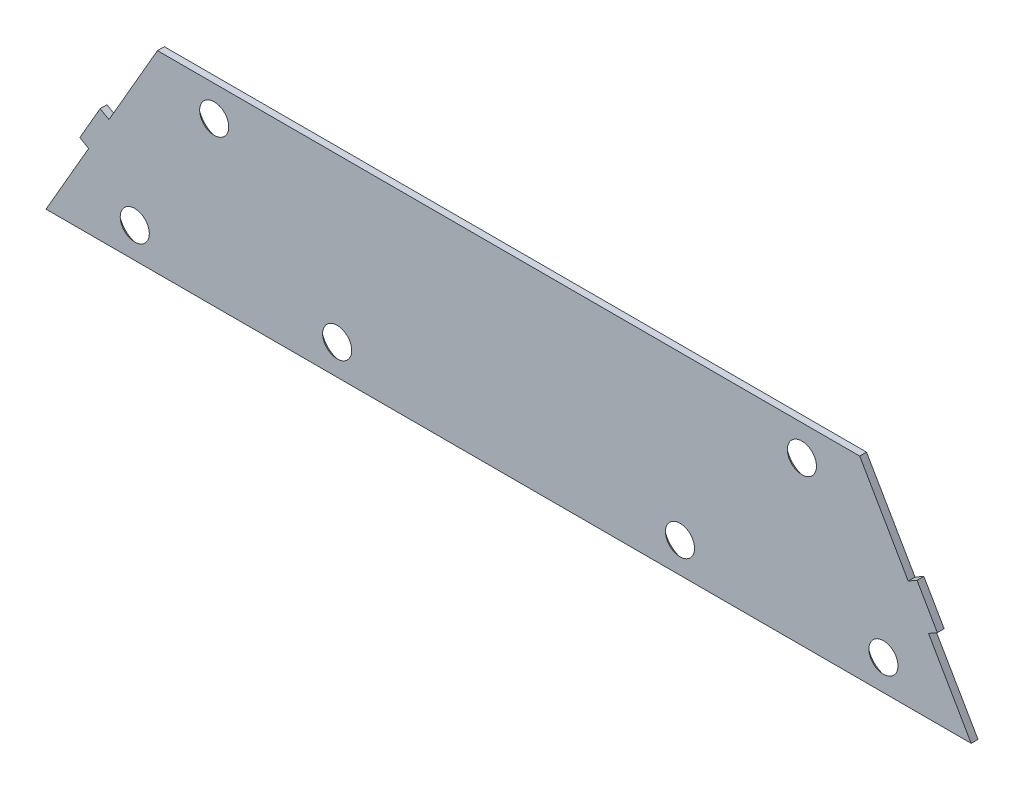
ISO-10303-21;
HEADER;
FILE_DESCRIPTION(('STEP AP214'),'2;1');
FILE_NAME('part.step','',(''),(''),'','','');
FILE_SCHEMA(('AUTOMOTIVE_DESIGN { 1 0 10303 214 1 1 1 1 }'));
ENDSEC;
DATA;
#1=APPLICATION_CONTEXT('core data for automotive mechanical design processes');
#2=APPLICATION_PROTOCOL_DEFINITION('international standard','automotive_design',2000,#1);
#3=PRODUCT_CONTEXT('',#1,'mechanical');
#4=PRODUCT('Part','Part','',(#3));
#5=PRODUCT_RELATED_PRODUCT_CATEGORY('part','',(#4));
#6=PRODUCT_DEFINITION_FORMATION('','',#4);
#7=PRODUCT_DEFINITION_CONTEXT('part definition',#1,'design');
#8=PRODUCT_DEFINITION('design','',#6,#7);
#9=PRODUCT_DEFINITION_SHAPE('','',#8);
#10=(LENGTH_UNIT() NAMED_UNIT(*) SI_UNIT(.MILLI.,.METRE.));
#11=(NAMED_UNIT(*) PLANE_ANGLE_UNIT() SI_UNIT($,.RADIAN.));
#12=(NAMED_UNIT(*) SI_UNIT($,.STERADIAN.) SOLID_ANGLE_UNIT());
#13=UNCERTAINTY_MEASURE_WITH_UNIT(LENGTH_MEASURE(1.E-05),#10,'distance_accuracy_value','');
#14=(GEOMETRIC_REPRESENTATION_CONTEXT(3) GLOBAL_UNCERTAINTY_ASSIGNED_CONTEXT((#13)) GLOBAL_UNIT_ASSIGNED_CONTEXT((#10,
#11,#12)) REPRESENTATION_CONTEXT('',''));
#15=CARTESIAN_POINT('',(0.,0.,0.));
#16=DIRECTION('',(0.,0.,1.));
#17=DIRECTION('',(1.,0.,0.));
#18=AXIS2_PLACEMENT_3D('',#15,#16,#17);
#19=CARTESIAN_POINT('',(0.,0.,1.0668));
#20=DIRECTION('',(0.,0.,1.));
#21=DIRECTION('',(1.,0.,0.));
#22=AXIS2_PLACEMENT_3D('',#19,#20,#21);
#23=PLANE('',#22);
#24=DIRECTION('',(-0.500000000000004,-0.866025403784436,0.));
#25=VECTOR('',#24,1.);
#26=CARTESIAN_POINT('',(-45.2150460747579,27.8355816877417,1.0668));
#27=LINE('',#26,#25);
#28=CARTESIAN_POINT('',(-64.1112230909537,-4.89355697312434,1.0668));
#29=VERTEX_POINT('',#28);
#30=CARTESIAN_POINT('',(-70.7726150620005,-16.4314263161086,1.0668));
#31=VERTEX_POINT('',#30);
#32=EDGE_CURVE('E129',#29,#31,#27,.T.);
#33=ORIENTED_EDGE('',*,*,#32,.T.);
#34=DIRECTION('',(1.,0.,0.));
#35=VECTOR('',#34,1.);
#36=CARTESIAN_POINT('',(75.603297833322,-16.4314263161089,1.0668));
#37=LINE('',#36,#35);
#38=CARTESIAN_POINT('',(73.7702107286445,-16.4314263161089,1.0668));
#39=VERTEX_POINT('',#38);
#40=EDGE_CURVE('E46',#31,#39,#37,.T.);
#41=ORIENTED_EDGE('',*,*,#40,.T.);
#42=DIRECTION('',(0.499999999999999,-0.866025403784439,0.));
#43=VECTOR('',#42,1.);
#44=CARTESIAN_POINT('',(48.2126417414022,27.8355816877415,1.0668));
#45=LINE('',#44,#43);
#46=CARTESIAN_POINT('',(67.1088187575979,-4.89355697312468,1.0668));
#47=VERTEX_POINT('',#46);
#48=EDGE_CURVE('E233',#47,#39,#45,.T.);
#49=ORIENTED_EDGE('',*,*,#48,.F.);
#50=DIRECTION('',(-0.866025403784438,-0.5,0.));
#51=VECTOR('',#50,1.);
#52=CARTESIAN_POINT('',(18.8961770161957,-32.7291386608662,1.0668));
#53=LINE('',#52,#51);
#54=CARTESIAN_POINT('',(68.4836340861059,-4.09980697312453,1.0668));
#55=VERTEX_POINT('',#54);
#56=EDGE_CURVE('E227',#55,#47,#53,.T.);
#57=ORIENTED_EDGE('',*,*,#56,.F.);
#58=DIRECTION('',(-0.500000000000004,0.866025403784436,0.));
#59=VECTOR('',#58,1.);
#60=CARTESIAN_POINT('',(58.1889703388898,13.731073683891,1.0668));
#61=LINE('',#60,#59);
#62=CARTESIAN_POINT('',(65.3086340861059,1.39945434090666,1.0668));
#63=VERTEX_POINT('',#62);
#64=EDGE_CURVE('E11',#55,#63,#61,.T.);
#65=ORIENTED_EDGE('',*,*,#64,.T.);
#66=DIRECTION('',(-0.866025403784439,-0.5,0.));
#67=VECTOR('',#66,1.);
#68=CARTESIAN_POINT('',(15.7211770161957,-27.229877346835,1.0668));
#69=LINE('',#68,#67);
#70=CARTESIAN_POINT('',(63.9338187575978,0.60570434090652,1.0668));
#71=VERTEX_POINT('',#70);
#72=EDGE_CURVE('E217',#63,#71,#69,.T.);
#73=ORIENTED_EDGE('',*,*,#72,.T.);
#74=DIRECTION('',(-0.5,0.866025403784439,0.));
#75=VECTOR('',#74,1.);
#76=CARTESIAN_POINT('',(48.2126417414022,27.8355816877415,1.0668));
#77=LINE('',#76,#75);
#78=CARTESIAN_POINT('',(56.3558832342125,13.731073683891,1.0668));
#79=VERTEX_POINT('',#78);
#80=EDGE_CURVE('E211',#71,#79,#77,.T.);
#81=ORIENTED_EDGE('',*,*,#80,.T.);
#82=DIRECTION('',(-1.,0.,0.));
#83=VECTOR('',#82,1.);
#84=CARTESIAN_POINT('',(58.1889703388898,13.731073683891,1.0668));
#85=LINE('',#84,#83);
#86=CARTESIAN_POINT('',(-53.3582875675682,13.7310736838913,1.0668));
#87=VERTEX_POINT('',#86);
#88=EDGE_CURVE('E150',#79,#87,#85,.T.);
#89=ORIENTED_EDGE('',*,*,#88,.T.);
#90=DIRECTION('',(0.500000000000005,0.866025403784436,0.));
#91=VECTOR('',#90,1.);
#92=CARTESIAN_POINT('',(-45.2150460747579,27.8355816877418,1.0668));
#93=LINE('',#92,#91);
#94=CARTESIAN_POINT('',(-60.9362230909537,0.605704340906837,1.0668));
#95=VERTEX_POINT('',#94);
#96=EDGE_CURVE('E243',#95,#87,#93,.T.);
#97=ORIENTED_EDGE('',*,*,#96,.F.);
#98=DIRECTION('',(0.866025403784436,-0.500000000000004,0.));
#99=VECTOR('',#98,1.);
#100=CARTESIAN_POINT('',(-12.7235813495517,-27.2298773468349,1.0668));
#101=LINE('',#100,#99);
#102=CARTESIAN_POINT('',(-62.3110384194617,1.39945434090699,1.0668));
#103=VERTEX_POINT('',#102);
#104=EDGE_CURVE('E249',#103,#95,#101,.T.);
#105=ORIENTED_EDGE('',*,*,#104,.F.);
#106=DIRECTION('',(-0.500000000000008,-0.866025403784434,0.));
#107=VECTOR('',#106,1.);
#108=CARTESIAN_POINT('',(-55.1913746722455,13.731073683891,1.0668));
#109=LINE('',#108,#107);
#110=CARTESIAN_POINT('',(-65.4860384194617,-4.09980697312419,1.0668));
#111=VERTEX_POINT('',#110);
#112=EDGE_CURVE('E148',#103,#111,#109,.T.);
#113=ORIENTED_EDGE('',*,*,#112,.T.);
#114=DIRECTION('',(0.866025403784436,-0.500000000000005,0.));
#115=VECTOR('',#114,1.);
#116=CARTESIAN_POINT('',(-15.8985813495517,-32.7291386608661,1.0668));
#117=LINE('',#116,#115);
#118=EDGE_CURVE('E135',#111,#29,#117,.T.);
#119=ORIENTED_EDGE('',*,*,#118,.T.);
#120=EDGE_LOOP('',(#33,#41,#49,#57,#65,#73,#81,#89,#97,#105,#113,#119));
#121=FACE_BOUND('',#120,.T.);
#122=CARTESIAN_POINT('',(28.2788107286445,-11.6689263161091,1.0668));
#123=DIRECTION('',(0.,0.,1.));
#124=DIRECTION('',(1.,0.,0.));
#125=AXIS2_PLACEMENT_3D('',#122,#123,#124);
#126=CIRCLE('',#125,2.27193726742048);
#127=CARTESIAN_POINT('',(30.550747996065,-11.6689263161091,1.0668));
#128=VERTEX_POINT('',#127);
#129=EDGE_CURVE('E200',#128,#128,#126,.T.);
#130=ORIENTED_EDGE('',*,*,#129,.F.);
#131=EDGE_LOOP('',(#130));
#132=FACE_BOUND('',#131,.T.);
#133=CARTESIAN_POINT('',(60.0627849379986,-11.668926316109,1.0668));
#134=DIRECTION('',(0.,0.,1.));
#135=DIRECTION('',(1.,0.,0.));
#136=AXIS2_PLACEMENT_3D('',#133,#134,#135);
#137=CIRCLE('',#136,2.27193726742048);
#138=CARTESIAN_POINT('',(62.3347222054191,-11.668926316109,1.0668));
#139=VERTEX_POINT('',#138);
#140=EDGE_CURVE('E182',#139,#139,#137,.T.);
#141=ORIENTED_EDGE('',*,*,#140,.F.);
#142=EDGE_LOOP('',(#141));
#143=FACE_BOUND('',#142,.T.);
#144=CARTESIAN_POINT('',(-25.2812150620014,-11.668926316109,1.0668));
#145=DIRECTION('',(0.,0.,1.));
#146=DIRECTION('',(1.,0.,0.));
#147=AXIS2_PLACEMENT_3D('',#144,#145,#146);
#148=CIRCLE('',#147,2.27193726742048);
#149=CARTESIAN_POINT('',(-23.0092777945809,-11.668926316109,1.0668));
#150=VERTEX_POINT('',#149);
#151=EDGE_CURVE('E158',#150,#150,#148,.T.);
#152=ORIENTED_EDGE('',*,*,#151,.F.);
#153=EDGE_LOOP('',(#152));
#154=FACE_BOUND('',#153,.T.);
#155=CARTESIAN_POINT('',(-56.9042150620014,-11.668926316109,1.0668));
#156=DIRECTION('',(0.,0.,1.));
#157=DIRECTION('',(1.,0.,0.));
#158=AXIS2_PLACEMENT_3D('',#155,#156,#157);
#159=CIRCLE('',#158,2.27193726742048);
#160=CARTESIAN_POINT('',(-54.6322777945809,-11.668926316109,1.0668));
#161=VERTEX_POINT('',#160);
#162=EDGE_CURVE('E176',#161,#161,#159,.T.);
#163=ORIENTED_EDGE('',*,*,#162,.F.);
#164=EDGE_LOOP('',(#163));
#165=FACE_BOUND('',#164,.T.);
#166=CARTESIAN_POINT('',(47.3288107286445,8.96857368389085,1.0668));
#167=DIRECTION('',(0.,0.,1.));
#168=DIRECTION('',(1.,0.,0.));
#169=AXIS2_PLACEMENT_3D('',#166,#167,#168);
#170=CIRCLE('',#169,2.27193726742048);
#171=CARTESIAN_POINT('',(49.600747996065,8.96857368389085,1.0668));
#172=VERTEX_POINT('',#171);
#173=EDGE_CURVE('E188',#172,#172,#170,.T.);
#174=ORIENTED_EDGE('',*,*,#173,.F.);
#175=EDGE_LOOP('',(#174));
#176=FACE_BOUND('',#175,.T.);
#177=CARTESIAN_POINT('',(-44.4921892713555,8.96857368389087,1.0668));
#178=DIRECTION('',(0.,0.,1.));
#179=DIRECTION('',(1.,0.,0.));
#180=AXIS2_PLACEMENT_3D('',#177,#178,#179);
#181=CIRCLE('',#180,2.27193726742048);
#182=CARTESIAN_POINT('',(-42.220252003935,8.96857368389087,1.0668));
#183=VERTEX_POINT('',#182);
#184=EDGE_CURVE('E194',#183,#183,#181,.T.);
#185=ORIENTED_EDGE('',*,*,#184,.F.);
#186=EDGE_LOOP('',(#185));
#187=FACE_BOUND('',#186,.T.);
#188=ADVANCED_FACE('F37',(#121,#132,#143,#154,#165,#176,#187),#23,.T.);
#189=CARTESIAN_POINT('',(0.,0.,0.));
#190=DIRECTION('',(0.,0.,1.));
#191=DIRECTION('',(1.,0.,0.));
#192=AXIS2_PLACEMENT_3D('',#189,#190,#191);
#193=PLANE('',#192);
#194=CARTESIAN_POINT('',(28.2788107286445,-11.6689263161091,0.));
#195=DIRECTION('',(0.,0.,-1.));
#196=DIRECTION('',(-1.,0.,0.));
#197=AXIS2_PLACEMENT_3D('',#194,#195,#196);
#198=CIRCLE('',#197,3.5433);
#199=CARTESIAN_POINT('',(24.7355107286445,-11.6689263161091,0.));
#200=VERTEX_POINT('',#199);
#201=EDGE_CURVE('E203',#200,#200,#198,.T.);
#202=ORIENTED_EDGE('',*,*,#201,.F.);
#203=EDGE_LOOP('',(#202));
#204=FACE_BOUND('',#203,.T.);
#205=CARTESIAN_POINT('',(-44.4921892713555,8.96857368389087,0.));
#206=DIRECTION('',(0.,0.,-1.));
#207=DIRECTION('',(-1.,0.,0.));
#208=AXIS2_PLACEMENT_3D('',#205,#206,#207);
#209=CIRCLE('',#208,3.5433);
#210=CARTESIAN_POINT('',(-48.0354892713555,8.96857368389087,0.));
#211=VERTEX_POINT('',#210);
#212=EDGE_CURVE('E197',#211,#211,#209,.T.);
#213=ORIENTED_EDGE('',*,*,#212,.F.);
#214=EDGE_LOOP('',(#213));
#215=FACE_BOUND('',#214,.T.);
#216=CARTESIAN_POINT('',(47.3288107286445,8.96857368389085,0.));
#217=DIRECTION('',(0.,0.,-1.));
#218=DIRECTION('',(-1.,0.,0.));
#219=AXIS2_PLACEMENT_3D('',#216,#217,#218);
#220=CIRCLE('',#219,3.5433);
#221=CARTESIAN_POINT('',(43.7855107286445,8.96857368389085,0.));
#222=VERTEX_POINT('',#221);
#223=EDGE_CURVE('E191',#222,#222,#220,.T.);
#224=ORIENTED_EDGE('',*,*,#223,.F.);
#225=EDGE_LOOP('',(#224));
#226=FACE_BOUND('',#225,.T.);
#227=CARTESIAN_POINT('',(60.0627849379986,-11.668926316109,0.));
#228=DIRECTION('',(0.,0.,-1.));
#229=DIRECTION('',(-1.,0.,0.));
#230=AXIS2_PLACEMENT_3D('',#227,#228,#229);
#231=CIRCLE('',#230,3.5433);
#232=CARTESIAN_POINT('',(56.5194849379986,-11.668926316109,0.));
#233=VERTEX_POINT('',#232);
#234=EDGE_CURVE('E185',#233,#233,#231,.T.);
#235=ORIENTED_EDGE('',*,*,#234,.F.);
#236=EDGE_LOOP('',(#235));
#237=FACE_BOUND('',#236,.T.);
#238=CARTESIAN_POINT('',(-56.9042150620014,-11.668926316109,0.));
#239=DIRECTION('',(0.,0.,-1.));
#240=DIRECTION('',(-1.,0.,0.));
#241=AXIS2_PLACEMENT_3D('',#238,#239,#240);
#242=CIRCLE('',#241,3.5433);
#243=CARTESIAN_POINT('',(-60.4475150620014,-11.668926316109,0.));
#244=VERTEX_POINT('',#243);
#245=EDGE_CURVE('E179',#244,#244,#242,.T.);
#246=ORIENTED_EDGE('',*,*,#245,.F.);
#247=EDGE_LOOP('',(#246));
#248=FACE_BOUND('',#247,.T.);
#249=CARTESIAN_POINT('',(-25.2812150620014,-11.668926316109,0.));
#250=DIRECTION('',(0.,0.,-1.));
#251=DIRECTION('',(-1.,0.,0.));
#252=AXIS2_PLACEMENT_3D('',#249,#250,#251);
#253=CIRCLE('',#252,3.5433);
#254=CARTESIAN_POINT('',(-28.8245150620014,-11.668926316109,0.));
#255=VERTEX_POINT('',#254);
#256=EDGE_CURVE('E173',#255,#255,#253,.T.);
#257=ORIENTED_EDGE('',*,*,#256,.F.);
#258=EDGE_LOOP('',(#257));
#259=FACE_BOUND('',#258,.T.);
#260=DIRECTION('',(1.,0.,0.));
#261=VECTOR('',#260,1.);
#262=CARTESIAN_POINT('',(75.603297833322,-16.4314263161089,0.));
#263=LINE('',#262,#261);
#264=CARTESIAN_POINT('',(-70.7726150620007,-16.431426316109,0.));
#265=VERTEX_POINT('',#264);
#266=CARTESIAN_POINT('',(73.7702107286445,-16.4314263161089,0.));
#267=VERTEX_POINT('',#266);
#268=EDGE_CURVE('E160',#265,#267,#263,.T.);
#269=ORIENTED_EDGE('',*,*,#268,.F.);
#270=DIRECTION('',(-0.500000000000004,-0.866025403784436,0.));
#271=VECTOR('',#270,1.);
#272=CARTESIAN_POINT('',(-45.2150460747579,27.8355816877417,0.));
#273=LINE('',#272,#271);
#274=CARTESIAN_POINT('',(-64.1112230909537,-4.89355697312434,0.));
#275=VERTEX_POINT('',#274);
#276=EDGE_CURVE('E54',#275,#265,#273,.T.);
#277=ORIENTED_EDGE('',*,*,#276,.F.);
#278=DIRECTION('',(0.866025403784436,-0.500000000000005,0.));
#279=VECTOR('',#278,1.);
#280=CARTESIAN_POINT('',(-15.8985813495517,-32.7291386608661,0.));
#281=LINE('',#280,#279);
#282=CARTESIAN_POINT('',(-65.4860384194617,-4.09980697312419,0.));
#283=VERTEX_POINT('',#282);
#284=EDGE_CURVE('E142',#283,#275,#281,.T.);
#285=ORIENTED_EDGE('',*,*,#284,.F.);
#286=DIRECTION('',(-0.500000000000008,-0.866025403784434,0.));
#287=VECTOR('',#286,1.);
#288=CARTESIAN_POINT('',(-55.1913746722455,13.731073683891,0.));
#289=LINE('',#288,#287);
#290=CARTESIAN_POINT('',(-62.3110384194617,1.39945434090667,0.));
#291=VERTEX_POINT('',#290);
#292=EDGE_CURVE('E157',#291,#283,#289,.T.);
#293=ORIENTED_EDGE('',*,*,#292,.F.);
#294=DIRECTION('',(0.866025403784436,-0.500000000000004,0.));
#295=VECTOR('',#294,1.);
#296=CARTESIAN_POINT('',(-12.7235813495517,-27.2298773468349,0.));
#297=LINE('',#296,#295);
#298=CARTESIAN_POINT('',(-60.9362230909537,0.605704340906837,0.));
#299=VERTEX_POINT('',#298);
#300=EDGE_CURVE('E62',#291,#299,#297,.T.);
#301=ORIENTED_EDGE('',*,*,#300,.T.);
#302=DIRECTION('',(0.500000000000005,0.866025403784436,0.));
#303=VECTOR('',#302,1.);
#304=CARTESIAN_POINT('',(-45.2150460747579,27.8355816877418,0.));
#305=LINE('',#304,#303);
#306=CARTESIAN_POINT('',(-53.3582875675682,13.7310736838913,0.));
#307=VERTEX_POINT('',#306);
#308=EDGE_CURVE('E246',#299,#307,#305,.T.);
#309=ORIENTED_EDGE('',*,*,#308,.T.);
#310=DIRECTION('',(-1.,0.,0.));
#311=VECTOR('',#310,1.);
#312=CARTESIAN_POINT('',(58.1889703388898,13.731073683891,0.));
#313=LINE('',#312,#311);
#314=CARTESIAN_POINT('',(56.3558832342125,13.731073683891,0.));
#315=VERTEX_POINT('',#314);
#316=EDGE_CURVE('E154',#315,#307,#313,.T.);
#317=ORIENTED_EDGE('',*,*,#316,.F.);
#318=DIRECTION('',(-0.5,0.866025403784439,0.));
#319=VECTOR('',#318,1.);
#320=CARTESIAN_POINT('',(48.2126417414022,27.8355816877415,0.));
#321=LINE('',#320,#319);
#322=CARTESIAN_POINT('',(63.9338187575978,0.605704340906517,0.));
#323=VERTEX_POINT('',#322);
#324=EDGE_CURVE('E215',#323,#315,#321,.T.);
#325=ORIENTED_EDGE('',*,*,#324,.F.);
#326=DIRECTION('',(-0.866025403784439,-0.5,0.));
#327=VECTOR('',#326,1.);
#328=CARTESIAN_POINT('',(15.7211770161957,-27.229877346835,0.));
#329=LINE('',#328,#327);
#330=CARTESIAN_POINT('',(65.3086340861059,1.39945434090666,0.));
#331=VERTEX_POINT('',#330);
#332=EDGE_CURVE('E218',#331,#323,#329,.T.);
#333=ORIENTED_EDGE('',*,*,#332,.F.);
#334=DIRECTION('',(-0.500000000000004,0.866025403784436,0.));
#335=VECTOR('',#334,1.);
#336=CARTESIAN_POINT('',(58.1889703388898,13.731073683891,0.));
#337=LINE('',#336,#335);
#338=CARTESIAN_POINT('',(68.4836340861059,-4.09980697312453,0.));
#339=VERTEX_POINT('',#338);
#340=EDGE_CURVE('E41',#339,#331,#337,.T.);
#341=ORIENTED_EDGE('',*,*,#340,.F.);
#342=DIRECTION('',(-0.866025403784438,-0.5,0.));
#343=VECTOR('',#342,1.);
#344=CARTESIAN_POINT('',(18.8961770161957,-32.7291386608662,0.));
#345=LINE('',#344,#343);
#346=CARTESIAN_POINT('',(67.1088187575979,-4.89355697312468,0.));
#347=VERTEX_POINT('',#346);
#348=EDGE_CURVE('E230',#339,#347,#345,.T.);
#349=ORIENTED_EDGE('',*,*,#348,.T.);
#350=DIRECTION('',(0.499999999999999,-0.866025403784439,0.));
#351=VECTOR('',#350,1.);
#352=CARTESIAN_POINT('',(48.2126417414022,27.8355816877415,0.));
#353=LINE('',#352,#351);
#354=EDGE_CURVE('E234',#347,#267,#353,.T.);
#355=ORIENTED_EDGE('',*,*,#354,.T.);
#356=EDGE_LOOP('',(#269,#277,#285,#293,#301,#309,#317,#325,#333,#341,#349,#355));
#357=FACE_BOUND('',#356,.T.);
#358=ADVANCED_FACE('F265',(#204,#215,#226,#237,#248,#259,#357),#193,.F.);
#359=CARTESIAN_POINT('',(58.1889703388898,13.731073683891,1.0668));
#360=DIRECTION('',(0.,-1.,0.));
#361=DIRECTION('',(1.,0.,0.));
#362=AXIS2_PLACEMENT_3D('',#359,#360,#361);
#363=PLANE('',#362);
#364=DIRECTION('',(0.,0.,-1.));
#365=VECTOR('',#364,1.);
#366=CARTESIAN_POINT('',(-53.3582875675682,13.7310736838913,1.0668));
#367=LINE('',#366,#365);
#368=EDGE_CURVE('E242',#87,#307,#367,.T.);
#369=ORIENTED_EDGE('',*,*,#368,.F.);
#370=ORIENTED_EDGE('',*,*,#88,.F.);
#371=DIRECTION('',(0.,0.,-1.));
#372=VECTOR('',#371,1.);
#373=CARTESIAN_POINT('',(56.3558832342125,13.731073683891,1.0668));
#374=LINE('',#373,#372);
#375=EDGE_CURVE('E210',#79,#315,#374,.T.);
#376=ORIENTED_EDGE('',*,*,#375,.T.);
#377=ORIENTED_EDGE('',*,*,#316,.T.);
#378=EDGE_LOOP('',(#369,#370,#376,#377));
#379=FACE_BOUND('',#378,.T.);
#380=ADVANCED_FACE('F39',(#379),#363,.F.);
#381=CARTESIAN_POINT('',(-55.1913746722455,13.731073683891,1.0668));
#382=DIRECTION('',(0.866025403784434,-0.500000000000008,0.));
#383=DIRECTION('',(0.500000000000008,0.866025403784434,0.));
#384=AXIS2_PLACEMENT_3D('',#381,#382,#383);
#385=PLANE('',#384);
#386=ORIENTED_EDGE('',*,*,#292,.T.);
#387=DIRECTION('',(0.,0.,-1.));
#388=VECTOR('',#387,1.);
#389=CARTESIAN_POINT('',(-65.4860384194617,-4.09980697312419,1.0668));
#390=LINE('',#389,#388);
#391=EDGE_CURVE('E134',#111,#283,#390,.T.);
#392=ORIENTED_EDGE('',*,*,#391,.F.);
#393=ORIENTED_EDGE('',*,*,#112,.F.);
#394=DIRECTION('',(0.,0.,-1.));
#395=VECTOR('',#394,1.);
#396=CARTESIAN_POINT('',(-62.3110384194617,1.39945434090699,1.0668));
#397=LINE('',#396,#395);
#398=EDGE_CURVE('E240',#103,#291,#397,.T.);
#399=ORIENTED_EDGE('',*,*,#398,.T.);
#400=EDGE_LOOP('',(#386,#392,#393,#399));
#401=FACE_BOUND('',#400,.T.);
#402=ADVANCED_FACE('F289',(#401),#385,.F.);
#403=CARTESIAN_POINT('',(75.603297833322,-16.4314263161089,1.0668));
#404=DIRECTION('',(0.,1.,0.));
#405=DIRECTION('',(-1.,0.,0.));
#406=AXIS2_PLACEMENT_3D('',#403,#404,#405);
#407=PLANE('',#406);
#408=ORIENTED_EDGE('',*,*,#40,.F.);
#409=DIRECTION('',(0.,0.,-1.));
#410=VECTOR('',#409,1.);
#411=CARTESIAN_POINT('',(-70.7726150620005,-16.4314263161086,1.0668));
#412=LINE('',#411,#410);
#413=EDGE_CURVE('E126',#31,#265,#412,.T.);
#414=ORIENTED_EDGE('',*,*,#413,.T.);
#415=ORIENTED_EDGE('',*,*,#268,.T.);
#416=DIRECTION('',(0.,0.,-1.));
#417=VECTOR('',#416,1.);
#418=CARTESIAN_POINT('',(73.7702107286445,-16.4314263161089,1.0668));
#419=LINE('',#418,#417);
#420=EDGE_CURVE('E147',#39,#267,#419,.T.);
#421=ORIENTED_EDGE('',*,*,#420,.F.);
#422=EDGE_LOOP('',(#408,#414,#415,#421));
#423=FACE_BOUND('',#422,.T.);
#424=ADVANCED_FACE('F145',(#423),#407,.F.);
#425=CARTESIAN_POINT('',(58.1889703388898,13.731073683891,1.0668));
#426=DIRECTION('',(-0.866025403784436,-0.500000000000004,0.));
#427=DIRECTION('',(0.500000000000004,-0.866025403784436,0.));
#428=AXIS2_PLACEMENT_3D('',#425,#426,#427);
#429=PLANE('',#428);
#430=DIRECTION('',(0.,0.,-1.));
#431=VECTOR('',#430,1.);
#432=CARTESIAN_POINT('',(68.4836340861059,-4.09980697312453,1.0668));
#433=LINE('',#432,#431);
#434=EDGE_CURVE('E226',#55,#339,#433,.T.);
#435=ORIENTED_EDGE('',*,*,#434,.T.);
#436=ORIENTED_EDGE('',*,*,#340,.T.);
#437=DIRECTION('',(0.,0.,-1.));
#438=VECTOR('',#437,1.);
#439=CARTESIAN_POINT('',(65.3086340861059,1.39945434090666,1.0668));
#440=LINE('',#439,#438);
#441=EDGE_CURVE('E206',#63,#331,#440,.T.);
#442=ORIENTED_EDGE('',*,*,#441,.F.);
#443=ORIENTED_EDGE('',*,*,#64,.F.);
#444=EDGE_LOOP('',(#435,#436,#442,#443));
#445=FACE_BOUND('',#444,.T.);
#446=ADVANCED_FACE('F274',(#445),#429,.F.);
#447=CARTESIAN_POINT('',(-25.2812150620014,-11.668926316109,0.));
#448=DIRECTION('',(0.,0.,-1.));
#449=DIRECTION('',(-1.,0.,0.));
#450=AXIS2_PLACEMENT_3D('',#447,#448,#449);
#451=CONICAL_SURFACE('',#450,3.5433,0.872664625997169);
#452=ORIENTED_EDGE('',*,*,#151,.T.);
#453=EDGE_LOOP('',(#452));
#454=FACE_BOUND('',#453,.T.);
#455=ORIENTED_EDGE('',*,*,#256,.T.);
#456=EDGE_LOOP('',(#455));
#457=FACE_BOUND('',#456,.T.);
#458=ADVANCED_FACE('F309',(#454,#457),#451,.F.);
#459=CARTESIAN_POINT('',(-56.9042150620014,-11.668926316109,0.));
#460=DIRECTION('',(0.,0.,-1.));
#461=DIRECTION('',(-1.,0.,0.));
#462=AXIS2_PLACEMENT_3D('',#459,#460,#461);
#463=CONICAL_SURFACE('',#462,3.5433,0.872664625997169);
#464=ORIENTED_EDGE('',*,*,#162,.T.);
#465=EDGE_LOOP('',(#464));
#466=FACE_BOUND('',#465,.T.);
#467=ORIENTED_EDGE('',*,*,#245,.T.);
#468=EDGE_LOOP('',(#467));
#469=FACE_BOUND('',#468,.T.);
#470=ADVANCED_FACE('F409',(#466,#469),#463,.F.);
#471=CARTESIAN_POINT('',(60.0627849379986,-11.668926316109,0.));
#472=DIRECTION('',(0.,0.,-1.));
#473=DIRECTION('',(-1.,0.,0.));
#474=AXIS2_PLACEMENT_3D('',#471,#472,#473);
#475=CONICAL_SURFACE('',#474,3.5433,0.872664625997169);
#476=ORIENTED_EDGE('',*,*,#140,.T.);
#477=EDGE_LOOP('',(#476));
#478=FACE_BOUND('',#477,.T.);
#479=ORIENTED_EDGE('',*,*,#234,.T.);
#480=EDGE_LOOP('',(#479));
#481=FACE_BOUND('',#480,.T.);
#482=ADVANCED_FACE('F399',(#478,#481),#475,.F.);
#483=CARTESIAN_POINT('',(47.3288107286445,8.96857368389085,0.));
#484=DIRECTION('',(0.,0.,-1.));
#485=DIRECTION('',(-1.,0.,0.));
#486=AXIS2_PLACEMENT_3D('',#483,#484,#485);
#487=CONICAL_SURFACE('',#486,3.5433,0.872664625997169);
#488=ORIENTED_EDGE('',*,*,#173,.T.);
#489=EDGE_LOOP('',(#488));
#490=FACE_BOUND('',#489,.T.);
#491=ORIENTED_EDGE('',*,*,#223,.T.);
#492=EDGE_LOOP('',(#491));
#493=FACE_BOUND('',#492,.T.);
#494=ADVANCED_FACE('F389',(#490,#493),#487,.F.);
#495=CARTESIAN_POINT('',(-44.4921892713555,8.96857368389087,0.));
#496=DIRECTION('',(0.,0.,-1.));
#497=DIRECTION('',(-1.,0.,0.));
#498=AXIS2_PLACEMENT_3D('',#495,#496,#497);
#499=CONICAL_SURFACE('',#498,3.5433,0.872664625997169);
#500=ORIENTED_EDGE('',*,*,#184,.T.);
#501=EDGE_LOOP('',(#500));
#502=FACE_BOUND('',#501,.T.);
#503=ORIENTED_EDGE('',*,*,#212,.T.);
#504=EDGE_LOOP('',(#503));
#505=FACE_BOUND('',#504,.T.);
#506=ADVANCED_FACE('F379',(#502,#505),#499,.F.);
#507=CARTESIAN_POINT('',(28.2788107286445,-11.6689263161091,0.));
#508=DIRECTION('',(0.,0.,-1.));
#509=DIRECTION('',(-1.,0.,0.));
#510=AXIS2_PLACEMENT_3D('',#507,#508,#509);
#511=CONICAL_SURFACE('',#510,3.5433,0.872664625997169);
#512=ORIENTED_EDGE('',*,*,#129,.T.);
#513=EDGE_LOOP('',(#512));
#514=FACE_BOUND('',#513,.T.);
#515=ORIENTED_EDGE('',*,*,#201,.T.);
#516=EDGE_LOOP('',(#515));
#517=FACE_BOUND('',#516,.T.);
#518=ADVANCED_FACE('F362',(#514,#517),#511,.F.);
#519=CARTESIAN_POINT('',(15.7211770161957,-27.229877346835,1.0668));
#520=DIRECTION('',(0.5,-0.866025403784439,0.));
#521=DIRECTION('',(0.866025403784439,0.5,0.));
#522=AXIS2_PLACEMENT_3D('',#519,#520,#521);
#523=PLANE('',#522);
#524=ORIENTED_EDGE('',*,*,#332,.T.);
#525=DIRECTION('',(0.,0.,-1.));
#526=VECTOR('',#525,1.);
#527=CARTESIAN_POINT('',(63.9338187575978,0.60570434090652,1.0668));
#528=LINE('',#527,#526);
#529=EDGE_CURVE('E207',#71,#323,#528,.T.);
#530=ORIENTED_EDGE('',*,*,#529,.F.);
#531=ORIENTED_EDGE('',*,*,#72,.F.);
#532=ORIENTED_EDGE('',*,*,#441,.T.);
#533=EDGE_LOOP('',(#524,#530,#531,#532));
#534=FACE_BOUND('',#533,.T.);
#535=ADVANCED_FACE('F277',(#534),#523,.F.);
#536=CARTESIAN_POINT('',(48.2126417414022,27.8355816877415,1.0668));
#537=DIRECTION('',(-0.866025403784438,-0.5,0.));
#538=DIRECTION('',(0.5,-0.866025403784439,0.));
#539=AXIS2_PLACEMENT_3D('',#536,#537,#538);
#540=PLANE('',#539);
#541=ORIENTED_EDGE('',*,*,#324,.T.);
#542=ORIENTED_EDGE('',*,*,#375,.F.);
#543=ORIENTED_EDGE('',*,*,#80,.F.);
#544=ORIENTED_EDGE('',*,*,#529,.T.);
#545=EDGE_LOOP('',(#541,#542,#543,#544));
#546=FACE_BOUND('',#545,.T.);
#547=ADVANCED_FACE('F281',(#546),#540,.F.);
#548=CARTESIAN_POINT('',(48.2126417414022,27.8355816877415,1.0668));
#549=DIRECTION('',(0.866025403784439,0.499999999999999,0.));
#550=DIRECTION('',(-0.499999999999999,0.866025403784439,0.));
#551=AXIS2_PLACEMENT_3D('',#548,#549,#550);
#552=PLANE('',#551);
#553=ORIENTED_EDGE('',*,*,#354,.F.);
#554=DIRECTION('',(0.,0.,-1.));
#555=VECTOR('',#554,1.);
#556=CARTESIAN_POINT('',(67.1088187575979,-4.89355697312468,1.0668));
#557=LINE('',#556,#555);
#558=EDGE_CURVE('E223',#47,#347,#557,.T.);
#559=ORIENTED_EDGE('',*,*,#558,.F.);
#560=ORIENTED_EDGE('',*,*,#48,.T.);
#561=ORIENTED_EDGE('',*,*,#420,.T.);
#562=EDGE_LOOP('',(#553,#559,#560,#561));
#563=FACE_BOUND('',#562,.T.);
#564=ADVANCED_FACE('F268',(#563),#552,.T.);
#565=CARTESIAN_POINT('',(18.8961770161957,-32.7291386608662,1.0668));
#566=DIRECTION('',(0.5,-0.866025403784438,0.));
#567=DIRECTION('',(0.866025403784438,0.5,0.));
#568=AXIS2_PLACEMENT_3D('',#565,#566,#567);
#569=PLANE('',#568);
#570=ORIENTED_EDGE('',*,*,#348,.F.);
#571=ORIENTED_EDGE('',*,*,#434,.F.);
#572=ORIENTED_EDGE('',*,*,#56,.T.);
#573=ORIENTED_EDGE('',*,*,#558,.T.);
#574=EDGE_LOOP('',(#570,#571,#572,#573));
#575=FACE_BOUND('',#574,.T.);
#576=ADVANCED_FACE('F270',(#575),#569,.T.);
#577=CARTESIAN_POINT('',(-12.7235813495517,-27.2298773468349,1.0668));
#578=DIRECTION('',(0.500000000000004,0.866025403784436,0.));
#579=DIRECTION('',(-0.866025403784436,0.500000000000004,0.));
#580=AXIS2_PLACEMENT_3D('',#577,#578,#579);
#581=PLANE('',#580);
#582=ORIENTED_EDGE('',*,*,#300,.F.);
#583=ORIENTED_EDGE('',*,*,#398,.F.);
#584=ORIENTED_EDGE('',*,*,#104,.T.);
#585=DIRECTION('',(0.,0.,-1.));
#586=VECTOR('',#585,1.);
#587=CARTESIAN_POINT('',(-60.9362230909537,0.605704340906837,1.0668));
#588=LINE('',#587,#586);
#589=EDGE_CURVE('E237',#95,#299,#588,.T.);
#590=ORIENTED_EDGE('',*,*,#589,.T.);
#591=EDGE_LOOP('',(#582,#583,#584,#590));
#592=FACE_BOUND('',#591,.T.);
#593=ADVANCED_FACE('F292',(#592),#581,.T.);
#594=CARTESIAN_POINT('',(-45.2150460747579,27.8355816877418,1.0668));
#595=DIRECTION('',(-0.866025403784436,0.500000000000005,0.));
#596=DIRECTION('',(-0.500000000000005,-0.866025403784436,0.));
#597=AXIS2_PLACEMENT_3D('',#594,#595,#596);
#598=PLANE('',#597);
#599=ORIENTED_EDGE('',*,*,#308,.F.);
#600=ORIENTED_EDGE('',*,*,#589,.F.);
#601=ORIENTED_EDGE('',*,*,#96,.T.);
#602=ORIENTED_EDGE('',*,*,#368,.T.);
#603=EDGE_LOOP('',(#599,#600,#601,#602));
#604=FACE_BOUND('',#603,.T.);
#605=ADVANCED_FACE('F286',(#604),#598,.T.);
#606=CARTESIAN_POINT('',(-45.2150460747579,27.8355816877417,1.0668));
#607=DIRECTION('',(0.866025403784436,-0.500000000000004,0.));
#608=DIRECTION('',(0.500000000000004,0.866025403784436,0.));
#609=AXIS2_PLACEMENT_3D('',#606,#607,#608);
#610=PLANE('',#609);
#611=ORIENTED_EDGE('',*,*,#276,.T.);
#612=ORIENTED_EDGE('',*,*,#413,.F.);
#613=ORIENTED_EDGE('',*,*,#32,.F.);
#614=DIRECTION('',(0.,0.,-1.));
#615=VECTOR('',#614,1.);
#616=CARTESIAN_POINT('',(-64.1112230909537,-4.89355697312434,1.0668));
#617=LINE('',#616,#615);
#618=EDGE_CURVE('E251',#29,#275,#617,.T.);
#619=ORIENTED_EDGE('',*,*,#618,.T.);
#620=EDGE_LOOP('',(#611,#612,#613,#619));
#621=FACE_BOUND('',#620,.T.);
#622=ADVANCED_FACE('F128',(#621),#610,.F.);
#623=CARTESIAN_POINT('',(-15.8985813495517,-32.7291386608661,1.0668));
#624=DIRECTION('',(0.500000000000005,0.866025403784436,0.));
#625=DIRECTION('',(-0.866025403784436,0.500000000000005,0.));
#626=AXIS2_PLACEMENT_3D('',#623,#624,#625);
#627=PLANE('',#626);
#628=ORIENTED_EDGE('',*,*,#284,.T.);
#629=ORIENTED_EDGE('',*,*,#618,.F.);
#630=ORIENTED_EDGE('',*,*,#118,.F.);
#631=ORIENTED_EDGE('',*,*,#391,.T.);
#632=EDGE_LOOP('',(#628,#629,#630,#631));
#633=FACE_BOUND('',#632,.T.);
#634=ADVANCED_FACE('F261',(#633),#627,.F.);
#635=CLOSED_SHELL('',(#188,#358,#380,#402,#424,#446,#458,#470,#482,#494,#506,#518,#535,#547,
#564,#576,#593,#605,#622,#634));
#636=MANIFOLD_SOLID_BREP('B2',#635);
#637=ADVANCED_BREP_SHAPE_REPRESENTATION('',(#18,#636),#14);
#638=SHAPE_DEFINITION_REPRESENTATION(#9,#637);
ENDSEC;
END-ISO-10303-21;
